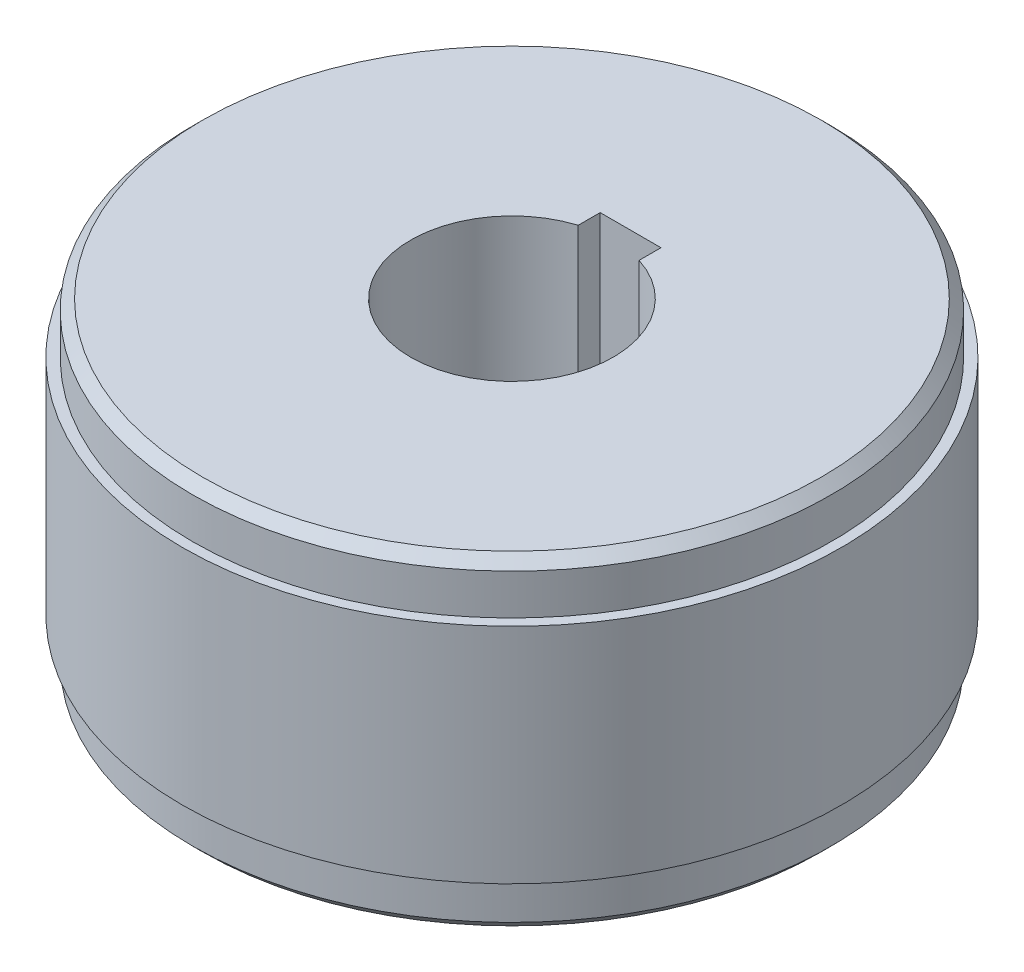
ISO-10303-21;
HEADER;
FILE_DESCRIPTION(('STEP AP214'),'2;1');
FILE_NAME('part.step','',(''),(''),'','','');
FILE_SCHEMA(('AUTOMOTIVE_DESIGN { 1 0 10303 214 1 1 1 1 }'));
ENDSEC;
DATA;
#1=APPLICATION_CONTEXT('core data for automotive mechanical design processes');
#2=APPLICATION_PROTOCOL_DEFINITION('international standard','automotive_design',2000,#1);
#3=PRODUCT_CONTEXT('',#1,'mechanical');
#4=PRODUCT('Part','Part','',(#3));
#5=PRODUCT_RELATED_PRODUCT_CATEGORY('part','',(#4));
#6=PRODUCT_DEFINITION_FORMATION('','',#4);
#7=PRODUCT_DEFINITION_CONTEXT('part definition',#1,'design');
#8=PRODUCT_DEFINITION('design','',#6,#7);
#9=PRODUCT_DEFINITION_SHAPE('','',#8);
#10=(LENGTH_UNIT() NAMED_UNIT(*) SI_UNIT(.MILLI.,.METRE.));
#11=(NAMED_UNIT(*) PLANE_ANGLE_UNIT() SI_UNIT($,.RADIAN.));
#12=(NAMED_UNIT(*) SI_UNIT($,.STERADIAN.) SOLID_ANGLE_UNIT());
#13=UNCERTAINTY_MEASURE_WITH_UNIT(LENGTH_MEASURE(1.E-05),#10,'distance_accuracy_value','');
#14=(GEOMETRIC_REPRESENTATION_CONTEXT(3) GLOBAL_UNCERTAINTY_ASSIGNED_CONTEXT((#13)) GLOBAL_UNIT_ASSIGNED_CONTEXT((#10,
#11,#12)) REPRESENTATION_CONTEXT('',''));
#15=CARTESIAN_POINT('',(0.,0.,0.));
#16=DIRECTION('',(0.,0.,1.));
#17=DIRECTION('',(1.,0.,0.));
#18=AXIS2_PLACEMENT_3D('',#15,#16,#17);
#19=CARTESIAN_POINT('',(0.,16.,0.));
#20=DIRECTION('',(0.,-1.,0.));
#21=DIRECTION('',(0.,0.,-1.));
#22=AXIS2_PLACEMENT_3D('',#19,#20,#21);
#23=CYLINDRICAL_SURFACE('',#22,31.5);
#24=CARTESIAN_POINT('',(0.,-15.,0.));
#25=DIRECTION('',(0.,1.,0.));
#26=DIRECTION('',(0.,0.,1.));
#27=AXIS2_PLACEMENT_3D('',#24,#25,#26);
#28=CIRCLE('',#27,31.5);
#29=CARTESIAN_POINT('',(0.,-15.,31.5));
#30=VERTEX_POINT('',#29);
#31=EDGE_CURVE('E55',#30,#30,#28,.T.);
#32=ORIENTED_EDGE('',*,*,#31,.T.);
#33=EDGE_LOOP('',(#32));
#34=FACE_BOUND('',#33,.T.);
#35=CARTESIAN_POINT('',(0.,-11.,0.));
#36=DIRECTION('',(0.,1.,0.));
#37=DIRECTION('',(0.,0.,1.));
#38=AXIS2_PLACEMENT_3D('',#35,#36,#37);
#39=CIRCLE('',#38,31.5);
#40=CARTESIAN_POINT('',(0.,-11.,31.5));
#41=VERTEX_POINT('',#40);
#42=EDGE_CURVE('E104',#41,#41,#39,.T.);
#43=ORIENTED_EDGE('',*,*,#42,.F.);
#44=EDGE_LOOP('',(#43));
#45=FACE_BOUND('',#44,.T.);
#46=ADVANCED_FACE('F46',(#34,#45),#23,.T.);
#47=CARTESIAN_POINT('',(0.,16.,0.));
#48=DIRECTION('',(0.,1.,0.));
#49=DIRECTION('',(0.,0.,1.));
#50=AXIS2_PLACEMENT_3D('',#47,#48,#49);
#51=PLANE('',#50);
#52=CARTESIAN_POINT('',(0.,16.,0.));
#53=DIRECTION('',(0.,1.,0.));
#54=DIRECTION('',(0.,0.,1.));
#55=AXIS2_PLACEMENT_3D('',#52,#53,#54);
#56=CIRCLE('',#55,30.5);
#57=CARTESIAN_POINT('',(0.,16.,30.5));
#58=VERTEX_POINT('',#57);
#59=EDGE_CURVE('E129',#58,#58,#56,.T.);
#60=ORIENTED_EDGE('',*,*,#59,.T.);
#61=EDGE_LOOP('',(#60));
#62=FACE_BOUND('',#61,.T.);
#63=DIRECTION('',(0.,0.,-1.));
#64=VECTOR('',#63,1.);
#65=CARTESIAN_POINT('',(3.00000000000001,16.,-11.7));
#66=LINE('',#65,#64);
#67=CARTESIAN_POINT('',(3.00000000000001,16.,-9.53939201416945));
#68=VERTEX_POINT('',#67);
#69=CARTESIAN_POINT('',(3.00000000000001,16.,-11.7));
#70=VERTEX_POINT('',#69);
#71=EDGE_CURVE('E96',#68,#70,#66,.T.);
#72=ORIENTED_EDGE('',*,*,#71,.F.);
#73=CARTESIAN_POINT('',(0.,16.,0.));
#74=DIRECTION('',(0.,1.,0.));
#75=DIRECTION('',(0.,0.,1.));
#76=AXIS2_PLACEMENT_3D('',#73,#74,#75);
#77=CIRCLE('',#76,10.);
#78=CARTESIAN_POINT('',(-2.99999999999999,16.,-9.53939201416946));
#79=VERTEX_POINT('',#78);
#80=EDGE_CURVE('E88',#79,#68,#77,.T.);
#81=ORIENTED_EDGE('',*,*,#80,.F.);
#82=DIRECTION('',(0.,0.,1.));
#83=VECTOR('',#82,1.);
#84=CARTESIAN_POINT('',(-2.99999999999999,16.,-9.53939201416946));
#85=LINE('',#84,#83);
#86=CARTESIAN_POINT('',(-2.99999999999999,16.,-11.7));
#87=VERTEX_POINT('',#86);
#88=EDGE_CURVE('E111',#87,#79,#85,.T.);
#89=ORIENTED_EDGE('',*,*,#88,.F.);
#90=DIRECTION('',(-1.,0.,0.));
#91=VECTOR('',#90,1.);
#92=CARTESIAN_POINT('',(-2.99999999999999,16.,-11.7));
#93=LINE('',#92,#91);
#94=EDGE_CURVE('E109',#70,#87,#93,.T.);
#95=ORIENTED_EDGE('',*,*,#94,.F.);
#96=EDGE_LOOP('',(#72,#81,#89,#95));
#97=FACE_BOUND('',#96,.T.);
#98=ADVANCED_FACE('F108',(#62,#97),#51,.T.);
#99=CARTESIAN_POINT('',(0.,-16.,0.));
#100=DIRECTION('',(0.,1.,0.));
#101=DIRECTION('',(0.,0.,1.));
#102=AXIS2_PLACEMENT_3D('',#99,#100,#101);
#103=PLANE('',#102);
#104=CARTESIAN_POINT('',(0.,-16.,0.));
#105=DIRECTION('',(0.,1.,0.));
#106=DIRECTION('',(0.,0.,1.));
#107=AXIS2_PLACEMENT_3D('',#104,#105,#106);
#108=CIRCLE('',#107,30.5);
#109=CARTESIAN_POINT('',(0.,-16.,30.5));
#110=VERTEX_POINT('',#109);
#111=EDGE_CURVE('E11',#110,#110,#108,.F.);
#112=ORIENTED_EDGE('',*,*,#111,.T.);
#113=EDGE_LOOP('',(#112));
#114=FACE_BOUND('',#113,.T.);
#115=CARTESIAN_POINT('',(0.,-16.,0.));
#116=DIRECTION('',(0.,1.,0.));
#117=DIRECTION('',(0.,0.,1.));
#118=AXIS2_PLACEMENT_3D('',#115,#116,#117);
#119=CIRCLE('',#118,10.);
#120=CARTESIAN_POINT('',(-2.99999999999999,-16.,-9.53939201416946));
#121=VERTEX_POINT('',#120);
#122=CARTESIAN_POINT('',(3.00000000000001,-16.,-9.53939201416945));
#123=VERTEX_POINT('',#122);
#124=EDGE_CURVE('E70',#121,#123,#119,.T.);
#125=ORIENTED_EDGE('',*,*,#124,.T.);
#126=DIRECTION('',(0.,0.,-1.));
#127=VECTOR('',#126,1.);
#128=CARTESIAN_POINT('',(3.00000000000001,-16.,-11.7));
#129=LINE('',#128,#127);
#130=CARTESIAN_POINT('',(3.00000000000001,-16.,-11.7));
#131=VERTEX_POINT('',#130);
#132=EDGE_CURVE('E103',#123,#131,#129,.T.);
#133=ORIENTED_EDGE('',*,*,#132,.T.);
#134=DIRECTION('',(-1.,0.,0.));
#135=VECTOR('',#134,1.);
#136=CARTESIAN_POINT('',(-2.99999999999999,-16.,-11.7));
#137=LINE('',#136,#135);
#138=CARTESIAN_POINT('',(-2.99999999999999,-16.,-11.7));
#139=VERTEX_POINT('',#138);
#140=EDGE_CURVE('E119',#131,#139,#137,.T.);
#141=ORIENTED_EDGE('',*,*,#140,.T.);
#142=DIRECTION('',(0.,0.,1.));
#143=VECTOR('',#142,1.);
#144=CARTESIAN_POINT('',(-2.99999999999999,-16.,-9.53939201416946));
#145=LINE('',#144,#143);
#146=EDGE_CURVE('E97',#139,#121,#145,.T.);
#147=ORIENTED_EDGE('',*,*,#146,.T.);
#148=EDGE_LOOP('',(#125,#133,#141,#147));
#149=FACE_BOUND('',#148,.T.);
#150=ADVANCED_FACE('F154',(#114,#149),#103,.F.);
#151=CARTESIAN_POINT('',(0.,15.,0.));
#152=DIRECTION('',(0.,1.,0.));
#153=DIRECTION('',(0.,0.,1.));
#154=AXIS2_PLACEMENT_3D('',#151,#152,#153);
#155=CIRCLE('',#154,31.5);
#156=CARTESIAN_POINT('',(0.,15.,31.5));
#157=VERTEX_POINT('',#156);
#158=EDGE_CURVE('E132',#157,#157,#155,.F.);
#159=ORIENTED_EDGE('',*,*,#158,.T.);
#160=EDGE_LOOP('',(#159));
#161=FACE_BOUND('',#160,.T.);
#162=CARTESIAN_POINT('',(0.,11.,0.));
#163=DIRECTION('',(0.,1.,0.));
#164=DIRECTION('',(0.,0.,1.));
#165=AXIS2_PLACEMENT_3D('',#162,#163,#164);
#166=CIRCLE('',#165,31.5);
#167=CARTESIAN_POINT('',(0.,11.,31.5));
#168=VERTEX_POINT('',#167);
#169=EDGE_CURVE('E170',#168,#168,#166,.T.);
#170=ORIENTED_EDGE('',*,*,#169,.T.);
#171=EDGE_LOOP('',(#170));
#172=FACE_BOUND('',#171,.T.);
#173=ADVANCED_FACE('F150',(#161,#172),#23,.T.);
#174=CARTESIAN_POINT('',(0.,16.,0.));
#175=DIRECTION('',(0.,-1.,0.));
#176=DIRECTION('',(0.,0.,-1.));
#177=AXIS2_PLACEMENT_3D('',#174,#175,#176);
#178=CYLINDRICAL_SURFACE('',#177,10.);
#179=ORIENTED_EDGE('',*,*,#124,.F.);
#180=DIRECTION('',(0.,-1.,0.));
#181=VECTOR('',#180,1.);
#182=CARTESIAN_POINT('',(-2.99999999999999,16.,-9.53939201416946));
#183=LINE('',#182,#181);
#184=EDGE_CURVE('E92',#79,#121,#183,.T.);
#185=ORIENTED_EDGE('',*,*,#184,.F.);
#186=ORIENTED_EDGE('',*,*,#80,.T.);
#187=DIRECTION('',(0.,-1.,0.));
#188=VECTOR('',#187,1.);
#189=CARTESIAN_POINT('',(3.00000000000001,16.,-9.53939201416945));
#190=LINE('',#189,#188);
#191=EDGE_CURVE('E91',#68,#123,#190,.T.);
#192=ORIENTED_EDGE('',*,*,#191,.T.);
#193=EDGE_LOOP('',(#179,#185,#186,#192));
#194=FACE_BOUND('',#193,.T.);
#195=ADVANCED_FACE('F90',(#194),#178,.F.);
#196=CARTESIAN_POINT('',(3.00000000000001,16.,-11.7));
#197=DIRECTION('',(-1.,0.,0.));
#198=DIRECTION('',(0.,0.,1.));
#199=AXIS2_PLACEMENT_3D('',#196,#197,#198);
#200=PLANE('',#199);
#201=ORIENTED_EDGE('',*,*,#132,.F.);
#202=ORIENTED_EDGE('',*,*,#191,.F.);
#203=ORIENTED_EDGE('',*,*,#71,.T.);
#204=DIRECTION('',(0.,-1.,0.));
#205=VECTOR('',#204,1.);
#206=CARTESIAN_POINT('',(3.00000000000001,16.,-11.7));
#207=LINE('',#206,#205);
#208=EDGE_CURVE('E105',#70,#131,#207,.T.);
#209=ORIENTED_EDGE('',*,*,#208,.T.);
#210=EDGE_LOOP('',(#201,#202,#203,#209));
#211=FACE_BOUND('',#210,.T.);
#212=ADVANCED_FACE('F100',(#211),#200,.T.);
#213=CARTESIAN_POINT('',(-2.99999999999999,16.,-11.7));
#214=DIRECTION('',(0.,0.,1.));
#215=DIRECTION('',(1.,0.,0.));
#216=AXIS2_PLACEMENT_3D('',#213,#214,#215);
#217=PLANE('',#216);
#218=ORIENTED_EDGE('',*,*,#140,.F.);
#219=ORIENTED_EDGE('',*,*,#208,.F.);
#220=ORIENTED_EDGE('',*,*,#94,.T.);
#221=DIRECTION('',(0.,-1.,0.));
#222=VECTOR('',#221,1.);
#223=CARTESIAN_POINT('',(-2.99999999999999,16.,-11.7));
#224=LINE('',#223,#222);
#225=EDGE_CURVE('E62',#87,#139,#224,.T.);
#226=ORIENTED_EDGE('',*,*,#225,.T.);
#227=EDGE_LOOP('',(#218,#219,#220,#226));
#228=FACE_BOUND('',#227,.T.);
#229=ADVANCED_FACE('F199',(#228),#217,.T.);
#230=CARTESIAN_POINT('',(-2.99999999999999,16.,-9.53939201416946));
#231=DIRECTION('',(1.,0.,0.));
#232=DIRECTION('',(0.,0.,-1.));
#233=AXIS2_PLACEMENT_3D('',#230,#231,#232);
#234=PLANE('',#233);
#235=ORIENTED_EDGE('',*,*,#146,.F.);
#236=ORIENTED_EDGE('',*,*,#225,.F.);
#237=ORIENTED_EDGE('',*,*,#88,.T.);
#238=ORIENTED_EDGE('',*,*,#184,.T.);
#239=EDGE_LOOP('',(#235,#236,#237,#238));
#240=FACE_BOUND('',#239,.T.);
#241=ADVANCED_FACE('F194',(#240),#234,.T.);
#242=CARTESIAN_POINT('',(0.,11.,0.));
#243=DIRECTION('',(0.,1.,0.));
#244=DIRECTION('',(0.,0.,1.));
#245=AXIS2_PLACEMENT_3D('',#242,#243,#244);
#246=PLANE('',#245);
#247=CARTESIAN_POINT('',(0.,11.,0.));
#248=DIRECTION('',(0.,1.,0.));
#249=DIRECTION('',(0.,0.,1.));
#250=AXIS2_PLACEMENT_3D('',#247,#248,#249);
#251=CIRCLE('',#250,32.5);
#252=CARTESIAN_POINT('',(0.,11.,32.5));
#253=VERTEX_POINT('',#252);
#254=EDGE_CURVE('E117',#253,#253,#251,.T.);
#255=ORIENTED_EDGE('',*,*,#254,.T.);
#256=EDGE_LOOP('',(#255));
#257=FACE_BOUND('',#256,.T.);
#258=ORIENTED_EDGE('',*,*,#169,.F.);
#259=EDGE_LOOP('',(#258));
#260=FACE_BOUND('',#259,.T.);
#261=ADVANCED_FACE('F179',(#257,#260),#246,.T.);
#262=CARTESIAN_POINT('',(0.,-11.,0.));
#263=DIRECTION('',(0.,1.,0.));
#264=DIRECTION('',(0.,0.,1.));
#265=AXIS2_PLACEMENT_3D('',#262,#263,#264);
#266=PLANE('',#265);
#267=CARTESIAN_POINT('',(0.,-11.,0.));
#268=DIRECTION('',(0.,1.,0.));
#269=DIRECTION('',(0.,0.,1.));
#270=AXIS2_PLACEMENT_3D('',#267,#268,#269);
#271=CIRCLE('',#270,32.5);
#272=CARTESIAN_POINT('',(0.,-11.,32.5));
#273=VERTEX_POINT('',#272);
#274=EDGE_CURVE('E172',#273,#273,#271,.T.);
#275=ORIENTED_EDGE('',*,*,#274,.F.);
#276=EDGE_LOOP('',(#275));
#277=FACE_BOUND('',#276,.T.);
#278=ORIENTED_EDGE('',*,*,#42,.T.);
#279=EDGE_LOOP('',(#278));
#280=FACE_BOUND('',#279,.T.);
#281=ADVANCED_FACE('F183',(#277,#280),#266,.F.);
#282=CARTESIAN_POINT('',(0.,11.,0.));
#283=DIRECTION('',(0.,-1.,0.));
#284=DIRECTION('',(0.,0.,-1.));
#285=AXIS2_PLACEMENT_3D('',#282,#283,#284);
#286=CYLINDRICAL_SURFACE('',#285,32.5);
#287=ORIENTED_EDGE('',*,*,#254,.F.);
#288=EDGE_LOOP('',(#287));
#289=FACE_BOUND('',#288,.T.);
#290=ORIENTED_EDGE('',*,*,#274,.T.);
#291=EDGE_LOOP('',(#290));
#292=FACE_BOUND('',#291,.T.);
#293=ADVANCED_FACE('F145',(#289,#292),#286,.T.);
#294=CARTESIAN_POINT('',(0.,16.,0.));
#295=DIRECTION('',(0.,-1.,0.));
#296=DIRECTION('',(0.,0.,-1.));
#297=AXIS2_PLACEMENT_3D('',#294,#295,#296);
#298=CONICAL_SURFACE('',#297,30.5,0.785398163397445);
#299=ORIENTED_EDGE('',*,*,#158,.F.);
#300=EDGE_LOOP('',(#299));
#301=FACE_BOUND('',#300,.T.);
#302=ORIENTED_EDGE('',*,*,#59,.F.);
#303=EDGE_LOOP('',(#302));
#304=FACE_BOUND('',#303,.T.);
#305=ADVANCED_FACE('F140',(#301,#304),#298,.T.);
#306=CARTESIAN_POINT('',(0.,-15.,0.));
#307=DIRECTION('',(0.,1.,0.));
#308=DIRECTION('',(0.,0.,1.));
#309=AXIS2_PLACEMENT_3D('',#306,#307,#308);
#310=CONICAL_SURFACE('',#309,31.5,0.785398163397452);
#311=ORIENTED_EDGE('',*,*,#111,.F.);
#312=EDGE_LOOP('',(#311));
#313=FACE_BOUND('',#312,.T.);
#314=ORIENTED_EDGE('',*,*,#31,.F.);
#315=EDGE_LOOP('',(#314));
#316=FACE_BOUND('',#315,.T.);
#317=ADVANCED_FACE('F49',(#313,#316),#310,.T.);
#318=CLOSED_SHELL('',(#46,#98,#150,#173,#195,#212,#229,#241,#261,#281,#293,#305,#317));
#319=MANIFOLD_SOLID_BREP('B2',#318);
#320=ADVANCED_BREP_SHAPE_REPRESENTATION('',(#18,#319),#14);
#321=SHAPE_DEFINITION_REPRESENTATION(#9,#320);
ENDSEC;
END-ISO-10303-21;
